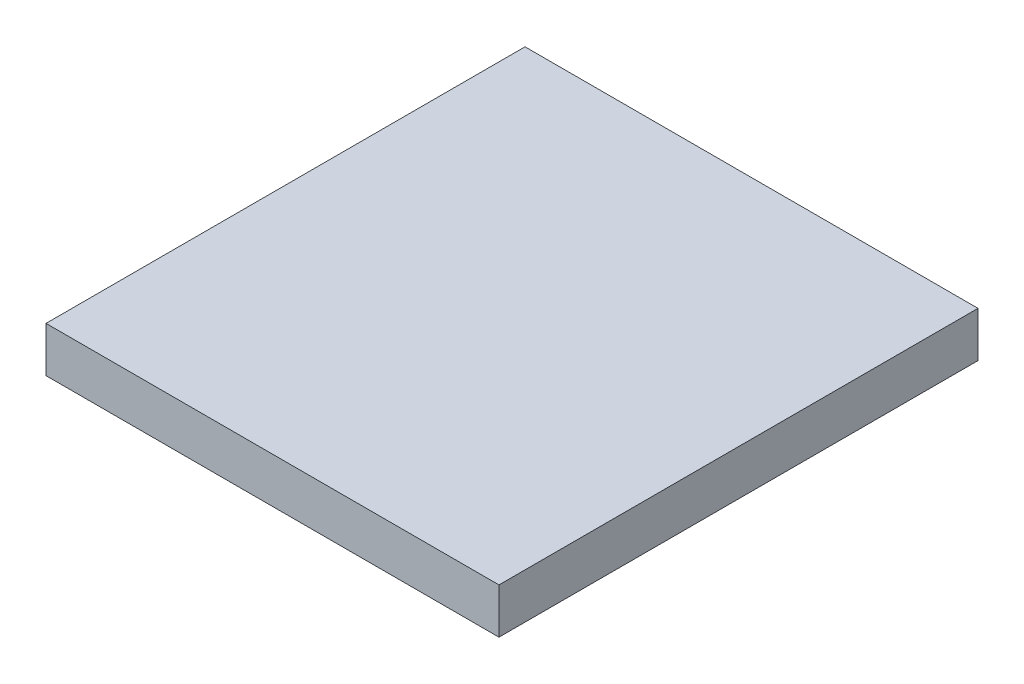
ISO-10303-21;
HEADER;
FILE_DESCRIPTION(('STEP AP214'),'2;1');
FILE_NAME('part.step','',(''),(''),'','','');
FILE_SCHEMA(('AUTOMOTIVE_DESIGN { 1 0 10303 214 1 1 1 1 }'));
ENDSEC;
DATA;
#1=APPLICATION_CONTEXT('core data for automotive mechanical design processes');
#2=APPLICATION_PROTOCOL_DEFINITION('international standard','automotive_design',2000,#1);
#3=PRODUCT_CONTEXT('',#1,'mechanical');
#4=PRODUCT('Part','Part','',(#3));
#5=PRODUCT_RELATED_PRODUCT_CATEGORY('part','',(#4));
#6=PRODUCT_DEFINITION_FORMATION('','',#4);
#7=PRODUCT_DEFINITION_CONTEXT('part definition',#1,'design');
#8=PRODUCT_DEFINITION('design','',#6,#7);
#9=PRODUCT_DEFINITION_SHAPE('','',#8);
#10=(LENGTH_UNIT() NAMED_UNIT(*) SI_UNIT(.MILLI.,.METRE.));
#11=(NAMED_UNIT(*) PLANE_ANGLE_UNIT() SI_UNIT($,.RADIAN.));
#12=(NAMED_UNIT(*) SI_UNIT($,.STERADIAN.) SOLID_ANGLE_UNIT());
#13=UNCERTAINTY_MEASURE_WITH_UNIT(LENGTH_MEASURE(1.E-05),#10,'distance_accuracy_value','');
#14=(GEOMETRIC_REPRESENTATION_CONTEXT(3) GLOBAL_UNCERTAINTY_ASSIGNED_CONTEXT((#13)) GLOBAL_UNIT_ASSIGNED_CONTEXT((#10,
#11,#12)) REPRESENTATION_CONTEXT('',''));
#15=CARTESIAN_POINT('',(0.,0.,0.));
#16=DIRECTION('',(0.,0.,1.));
#17=DIRECTION('',(1.,0.,0.));
#18=AXIS2_PLACEMENT_3D('',#15,#16,#17);
#19=CARTESIAN_POINT('',(0.,4.,0.));
#20=DIRECTION('',(1.,0.,0.));
#21=DIRECTION('',(0.,0.,-1.));
#22=AXIS2_PLACEMENT_3D('',#19,#20,#21);
#23=PLANE('',#22);
#24=DIRECTION('',(0.,0.,1.));
#25=VECTOR('',#24,1.);
#26=CARTESIAN_POINT('',(0.,0.,0.));
#27=LINE('',#26,#25);
#28=CARTESIAN_POINT('',(0.,0.,0.));
#29=VERTEX_POINT('',#28);
#30=CARTESIAN_POINT('',(0.,0.,42.3));
#31=VERTEX_POINT('',#30);
#32=EDGE_CURVE('E113',#29,#31,#27,.T.);
#33=ORIENTED_EDGE('',*,*,#32,.T.);
#34=DIRECTION('',(0.,-1.,0.));
#35=VECTOR('',#34,1.);
#36=CARTESIAN_POINT('',(0.,4.,42.3));
#37=LINE('',#36,#35);
#38=CARTESIAN_POINT('',(0.,4.,42.3));
#39=VERTEX_POINT('',#38);
#40=EDGE_CURVE('E11',#39,#31,#37,.T.);
#41=ORIENTED_EDGE('',*,*,#40,.F.);
#42=DIRECTION('',(0.,0.,1.));
#43=VECTOR('',#42,1.);
#44=CARTESIAN_POINT('',(0.,4.,0.));
#45=LINE('',#44,#43);
#46=CARTESIAN_POINT('',(0.,4.,0.));
#47=VERTEX_POINT('',#46);
#48=EDGE_CURVE('E97',#47,#39,#45,.T.);
#49=ORIENTED_EDGE('',*,*,#48,.F.);
#50=DIRECTION('',(0.,-1.,0.));
#51=VECTOR('',#50,1.);
#52=CARTESIAN_POINT('',(0.,4.,0.));
#53=LINE('',#52,#51);
#54=EDGE_CURVE('E109',#47,#29,#53,.T.);
#55=ORIENTED_EDGE('',*,*,#54,.T.);
#56=EDGE_LOOP('',(#33,#41,#49,#55));
#57=FACE_BOUND('',#56,.T.);
#58=ADVANCED_FACE('F45',(#57),#23,.F.);
#59=CARTESIAN_POINT('',(0.,4.,42.3));
#60=DIRECTION('',(0.,0.,-1.));
#61=DIRECTION('',(-1.,0.,0.));
#62=AXIS2_PLACEMENT_3D('',#59,#60,#61);
#63=PLANE('',#62);
#64=DIRECTION('',(1.,0.,0.));
#65=VECTOR('',#64,1.);
#66=CARTESIAN_POINT('',(0.,0.,42.3));
#67=LINE('',#66,#65);
#68=CARTESIAN_POINT('',(40.,0.,42.3));
#69=VERTEX_POINT('',#68);
#70=EDGE_CURVE('E102',#31,#69,#67,.T.);
#71=ORIENTED_EDGE('',*,*,#70,.T.);
#72=DIRECTION('',(0.,-1.,0.));
#73=VECTOR('',#72,1.);
#74=CARTESIAN_POINT('',(40.,4.,42.3));
#75=LINE('',#74,#73);
#76=CARTESIAN_POINT('',(40.,4.,42.3));
#77=VERTEX_POINT('',#76);
#78=EDGE_CURVE('E54',#77,#69,#75,.T.);
#79=ORIENTED_EDGE('',*,*,#78,.F.);
#80=DIRECTION('',(1.,0.,0.));
#81=VECTOR('',#80,1.);
#82=CARTESIAN_POINT('',(0.,4.,42.3));
#83=LINE('',#82,#81);
#84=EDGE_CURVE('E92',#39,#77,#83,.T.);
#85=ORIENTED_EDGE('',*,*,#84,.F.);
#86=ORIENTED_EDGE('',*,*,#40,.T.);
#87=EDGE_LOOP('',(#71,#79,#85,#86));
#88=FACE_BOUND('',#87,.T.);
#89=ADVANCED_FACE('F101',(#88),#63,.F.);
#90=CARTESIAN_POINT('',(40.,4.,0.));
#91=DIRECTION('',(-1.,0.,0.));
#92=DIRECTION('',(0.,0.,1.));
#93=AXIS2_PLACEMENT_3D('',#90,#91,#92);
#94=PLANE('',#93);
#95=DIRECTION('',(0.,0.,-1.));
#96=VECTOR('',#95,1.);
#97=CARTESIAN_POINT('',(40.,0.,0.));
#98=LINE('',#97,#96);
#99=CARTESIAN_POINT('',(40.,0.,0.));
#100=VERTEX_POINT('',#99);
#101=EDGE_CURVE('E79',#69,#100,#98,.T.);
#102=ORIENTED_EDGE('',*,*,#101,.T.);
#103=DIRECTION('',(0.,-1.,0.));
#104=VECTOR('',#103,1.);
#105=CARTESIAN_POINT('',(40.,4.,0.));
#106=LINE('',#105,#104);
#107=CARTESIAN_POINT('',(40.,4.,0.));
#108=VERTEX_POINT('',#107);
#109=EDGE_CURVE('E104',#108,#100,#106,.T.);
#110=ORIENTED_EDGE('',*,*,#109,.F.);
#111=DIRECTION('',(0.,0.,-1.));
#112=VECTOR('',#111,1.);
#113=CARTESIAN_POINT('',(40.,4.,0.));
#114=LINE('',#113,#112);
#115=EDGE_CURVE('E95',#77,#108,#114,.T.);
#116=ORIENTED_EDGE('',*,*,#115,.F.);
#117=ORIENTED_EDGE('',*,*,#78,.T.);
#118=EDGE_LOOP('',(#102,#110,#116,#117));
#119=FACE_BOUND('',#118,.T.);
#120=ADVANCED_FACE('F105',(#119),#94,.F.);
#121=CARTESIAN_POINT('',(0.,4.,0.));
#122=DIRECTION('',(0.,0.,1.));
#123=DIRECTION('',(1.,0.,0.));
#124=AXIS2_PLACEMENT_3D('',#121,#122,#123);
#125=PLANE('',#124);
#126=DIRECTION('',(-1.,0.,0.));
#127=VECTOR('',#126,1.);
#128=CARTESIAN_POINT('',(0.,0.,0.));
#129=LINE('',#128,#127);
#130=EDGE_CURVE('E85',#100,#29,#129,.T.);
#131=ORIENTED_EDGE('',*,*,#130,.T.);
#132=ORIENTED_EDGE('',*,*,#54,.F.);
#133=DIRECTION('',(-1.,0.,0.));
#134=VECTOR('',#133,1.);
#135=CARTESIAN_POINT('',(0.,4.,0.));
#136=LINE('',#135,#134);
#137=EDGE_CURVE('E62',#108,#47,#136,.T.);
#138=ORIENTED_EDGE('',*,*,#137,.F.);
#139=ORIENTED_EDGE('',*,*,#109,.T.);
#140=EDGE_LOOP('',(#131,#132,#138,#139));
#141=FACE_BOUND('',#140,.T.);
#142=ADVANCED_FACE('F126',(#141),#125,.F.);
#143=CARTESIAN_POINT('',(0.,4.,0.));
#144=DIRECTION('',(0.,1.,0.));
#145=DIRECTION('',(0.,0.,1.));
#146=AXIS2_PLACEMENT_3D('',#143,#144,#145);
#147=PLANE('',#146);
#148=ORIENTED_EDGE('',*,*,#48,.T.);
#149=ORIENTED_EDGE('',*,*,#84,.T.);
#150=ORIENTED_EDGE('',*,*,#115,.T.);
#151=ORIENTED_EDGE('',*,*,#137,.T.);
#152=EDGE_LOOP('',(#148,#149,#150,#151));
#153=FACE_BOUND('',#152,.T.);
#154=ADVANCED_FACE('F93',(#153),#147,.T.);
#155=CARTESIAN_POINT('',(0.,0.,0.));
#156=DIRECTION('',(0.,1.,0.));
#157=DIRECTION('',(0.,0.,1.));
#158=AXIS2_PLACEMENT_3D('',#155,#156,#157);
#159=PLANE('',#158);
#160=ORIENTED_EDGE('',*,*,#32,.F.);
#161=ORIENTED_EDGE('',*,*,#130,.F.);
#162=ORIENTED_EDGE('',*,*,#101,.F.);
#163=ORIENTED_EDGE('',*,*,#70,.F.);
#164=EDGE_LOOP('',(#160,#161,#162,#163));
#165=FACE_BOUND('',#164,.T.);
#166=ADVANCED_FACE('F129',(#165),#159,.F.);
#167=CLOSED_SHELL('',(#58,#89,#120,#142,#154,#166));
#168=MANIFOLD_SOLID_BREP('B2',#167);
#169=ADVANCED_BREP_SHAPE_REPRESENTATION('',(#18,#168),#14);
#170=SHAPE_DEFINITION_REPRESENTATION(#9,#169);
ENDSEC;
END-ISO-10303-21;
